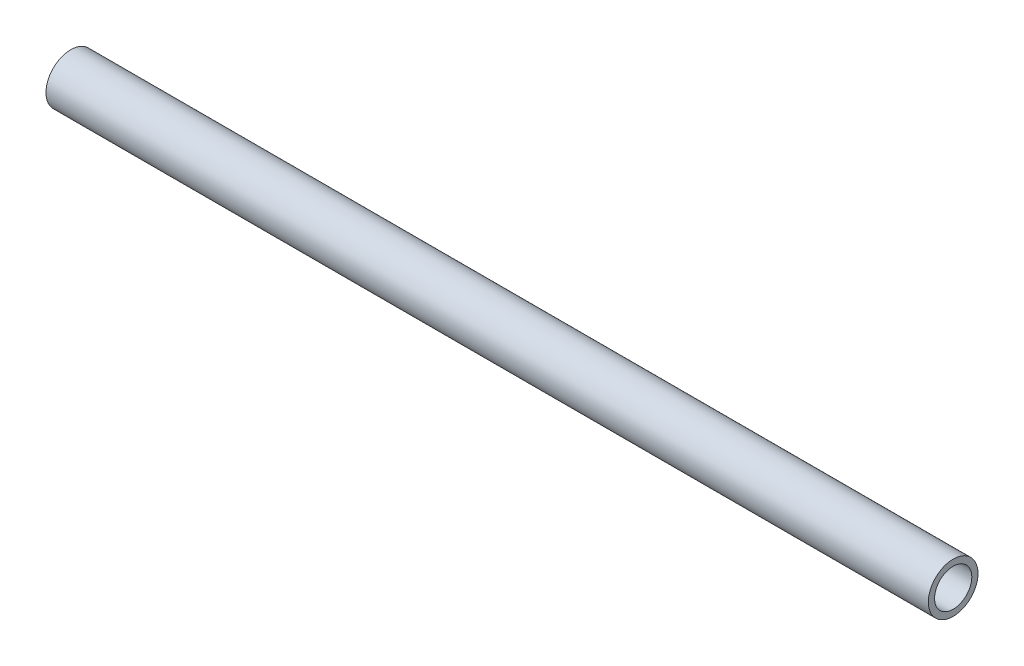
ISO-10303-21;
HEADER;
FILE_DESCRIPTION(('STEP AP214'),'2;1');
FILE_NAME('part.step','',(''),(''),'','','');
FILE_SCHEMA(('AUTOMOTIVE_DESIGN { 1 0 10303 214 1 1 1 1 }'));
ENDSEC;
DATA;
#1=APPLICATION_CONTEXT('core data for automotive mechanical design processes');
#2=APPLICATION_PROTOCOL_DEFINITION('international standard','automotive_design',2000,#1);
#3=PRODUCT_CONTEXT('',#1,'mechanical');
#4=PRODUCT('Part','Part','',(#3));
#5=PRODUCT_RELATED_PRODUCT_CATEGORY('part','',(#4));
#6=PRODUCT_DEFINITION_FORMATION('','',#4);
#7=PRODUCT_DEFINITION_CONTEXT('part definition',#1,'design');
#8=PRODUCT_DEFINITION('design','',#6,#7);
#9=PRODUCT_DEFINITION_SHAPE('','',#8);
#10=(LENGTH_UNIT() NAMED_UNIT(*) SI_UNIT(.MILLI.,.METRE.));
#11=(NAMED_UNIT(*) PLANE_ANGLE_UNIT() SI_UNIT($,.RADIAN.));
#12=(NAMED_UNIT(*) SI_UNIT($,.STERADIAN.) SOLID_ANGLE_UNIT());
#13=UNCERTAINTY_MEASURE_WITH_UNIT(LENGTH_MEASURE(1.E-05),#10,'distance_accuracy_value','');
#14=(GEOMETRIC_REPRESENTATION_CONTEXT(3) GLOBAL_UNCERTAINTY_ASSIGNED_CONTEXT((#13)) GLOBAL_UNIT_ASSIGNED_CONTEXT((#10,
#11,#12)) REPRESENTATION_CONTEXT('',''));
#15=CARTESIAN_POINT('',(0.,0.,0.));
#16=DIRECTION('',(0.,0.,1.));
#17=DIRECTION('',(1.,0.,0.));
#18=AXIS2_PLACEMENT_3D('',#15,#16,#17);
#19=CARTESIAN_POINT('',(17.77,0.,0.));
#20=DIRECTION('',(1.,0.,0.));
#21=DIRECTION('',(0.,0.,-1.));
#22=AXIS2_PLACEMENT_3D('',#19,#20,#21);
#23=PLANE('',#22);
#24=CARTESIAN_POINT('',(17.77,0.,0.));
#25=DIRECTION('',(1.,0.,0.));
#26=DIRECTION('',(0.,0.,-1.));
#27=AXIS2_PLACEMENT_3D('',#24,#25,#26);
#28=CIRCLE('',#27,0.5);
#29=CARTESIAN_POINT('',(17.77,0.,-0.5));
#30=VERTEX_POINT('',#29);
#31=EDGE_CURVE('E10',#30,#30,#28,.T.);
#32=ORIENTED_EDGE('',*,*,#31,.T.);
#33=EDGE_LOOP('',(#32));
#34=FACE_BOUND('',#33,.T.);
#35=CARTESIAN_POINT('',(17.77,0.,0.));
#36=DIRECTION('',(1.,0.,0.));
#37=DIRECTION('',(0.,0.,-1.));
#38=AXIS2_PLACEMENT_3D('',#35,#36,#37);
#39=CIRCLE('',#38,0.375);
#40=CARTESIAN_POINT('',(17.77,0.,-0.375));
#41=VERTEX_POINT('',#40);
#42=EDGE_CURVE('E50',#41,#41,#39,.T.);
#43=ORIENTED_EDGE('',*,*,#42,.F.);
#44=EDGE_LOOP('',(#43));
#45=FACE_BOUND('',#44,.T.);
#46=ADVANCED_FACE('F37',(#34,#45),#23,.T.);
#47=CARTESIAN_POINT('',(0.,0.,0.));
#48=DIRECTION('',(1.,0.,0.));
#49=DIRECTION('',(0.,0.,-1.));
#50=AXIS2_PLACEMENT_3D('',#47,#48,#49);
#51=PLANE('',#50);
#52=CARTESIAN_POINT('',(0.,0.,0.));
#53=DIRECTION('',(1.,0.,0.));
#54=DIRECTION('',(0.,0.,-1.));
#55=AXIS2_PLACEMENT_3D('',#52,#53,#54);
#56=CIRCLE('',#55,0.5);
#57=CARTESIAN_POINT('',(0.,0.,-0.5));
#58=VERTEX_POINT('',#57);
#59=EDGE_CURVE('E41',#58,#58,#56,.T.);
#60=ORIENTED_EDGE('',*,*,#59,.F.);
#61=EDGE_LOOP('',(#60));
#62=FACE_BOUND('',#61,.T.);
#63=CARTESIAN_POINT('',(0.,0.,0.));
#64=DIRECTION('',(1.,0.,0.));
#65=DIRECTION('',(0.,0.,-1.));
#66=AXIS2_PLACEMENT_3D('',#63,#64,#65);
#67=CIRCLE('',#66,0.375);
#68=CARTESIAN_POINT('',(0.,0.,-0.375));
#69=VERTEX_POINT('',#68);
#70=EDGE_CURVE('E52',#69,#69,#67,.T.);
#71=ORIENTED_EDGE('',*,*,#70,.T.);
#72=EDGE_LOOP('',(#71));
#73=FACE_BOUND('',#72,.T.);
#74=ADVANCED_FACE('F64',(#62,#73),#51,.F.);
#75=CARTESIAN_POINT('',(17.77,0.,0.));
#76=DIRECTION('',(-1.,0.,0.));
#77=DIRECTION('',(0.,0.,1.));
#78=AXIS2_PLACEMENT_3D('',#75,#76,#77);
#79=CYLINDRICAL_SURFACE('',#78,0.5);
#80=ORIENTED_EDGE('',*,*,#31,.F.);
#81=EDGE_LOOP('',(#80));
#82=FACE_BOUND('',#81,.T.);
#83=ORIENTED_EDGE('',*,*,#59,.T.);
#84=EDGE_LOOP('',(#83));
#85=FACE_BOUND('',#84,.T.);
#86=ADVANCED_FACE('F39',(#82,#85),#79,.T.);
#87=CARTESIAN_POINT('',(17.77,0.,0.));
#88=DIRECTION('',(-1.,0.,0.));
#89=DIRECTION('',(0.,0.,1.));
#90=AXIS2_PLACEMENT_3D('',#87,#88,#89);
#91=CYLINDRICAL_SURFACE('',#90,0.375);
#92=ORIENTED_EDGE('',*,*,#42,.T.);
#93=EDGE_LOOP('',(#92));
#94=FACE_BOUND('',#93,.T.);
#95=ORIENTED_EDGE('',*,*,#70,.F.);
#96=EDGE_LOOP('',(#95));
#97=FACE_BOUND('',#96,.T.);
#98=ADVANCED_FACE('F60',(#94,#97),#91,.F.);
#99=CLOSED_SHELL('',(#46,#74,#86,#98));
#100=MANIFOLD_SOLID_BREP('B2',#99);
#101=ADVANCED_BREP_SHAPE_REPRESENTATION('',(#18,#100),#14);
#102=SHAPE_DEFINITION_REPRESENTATION(#9,#101);
ENDSEC;
END-ISO-10303-21;
